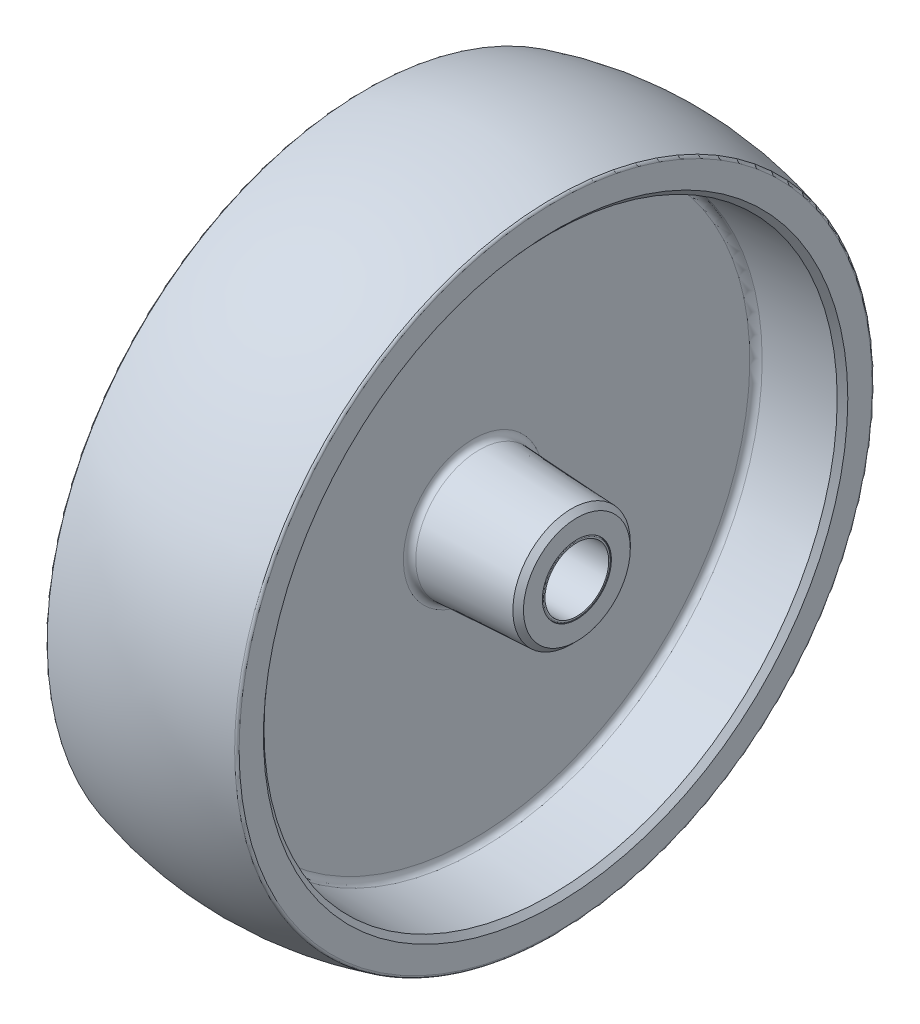
ISO-10303-21;
HEADER;
FILE_DESCRIPTION(('STEP AP214'),'2;1');
FILE_NAME('part.step','',(''),(''),'','','');
FILE_SCHEMA(('AUTOMOTIVE_DESIGN { 1 0 10303 214 1 1 1 1 }'));
ENDSEC;
DATA;
#1=APPLICATION_CONTEXT('core data for automotive mechanical design processes');
#2=APPLICATION_PROTOCOL_DEFINITION('international standard','automotive_design',2000,#1);
#3=PRODUCT_CONTEXT('',#1,'mechanical');
#4=PRODUCT('Part','Part','',(#3));
#5=PRODUCT_RELATED_PRODUCT_CATEGORY('part','',(#4));
#6=PRODUCT_DEFINITION_FORMATION('','',#4);
#7=PRODUCT_DEFINITION_CONTEXT('part definition',#1,'design');
#8=PRODUCT_DEFINITION('design','',#6,#7);
#9=PRODUCT_DEFINITION_SHAPE('','',#8);
#10=(LENGTH_UNIT() NAMED_UNIT(*) SI_UNIT(.MILLI.,.METRE.));
#11=(NAMED_UNIT(*) PLANE_ANGLE_UNIT() SI_UNIT($,.RADIAN.));
#12=(NAMED_UNIT(*) SI_UNIT($,.STERADIAN.) SOLID_ANGLE_UNIT());
#13=UNCERTAINTY_MEASURE_WITH_UNIT(LENGTH_MEASURE(1.E-05),#10,'distance_accuracy_value','');
#14=(GEOMETRIC_REPRESENTATION_CONTEXT(3) GLOBAL_UNCERTAINTY_ASSIGNED_CONTEXT((#13)) GLOBAL_UNIT_ASSIGNED_CONTEXT((#10,
#11,#12)) REPRESENTATION_CONTEXT('',''));
#15=CARTESIAN_POINT('',(0.,0.,0.));
#16=DIRECTION('',(0.,0.,1.));
#17=DIRECTION('',(1.,0.,0.));
#18=AXIS2_PLACEMENT_3D('',#15,#16,#17);
#19=CARTESIAN_POINT('',(2.5,53.1876794211129,0.));
#20=DIRECTION('',(-1.,0.,0.));
#21=DIRECTION('',(0.,0.,1.));
#22=AXIS2_PLACEMENT_3D('',#19,#20,#21);
#23=PLANE('',#22);
#24=CARTESIAN_POINT('',(2.5,0.,0.));
#25=DIRECTION('',(-1.,0.,0.));
#26=DIRECTION('',(0.,1.,0.));
#27=AXIS2_PLACEMENT_3D('',#24,#25,#26);
#28=CIRCLE('',#27,13.1607091760771);
#29=CARTESIAN_POINT('',(2.5,13.1607091760771,0.));
#30=VERTEX_POINT('',#29);
#31=EDGE_CURVE('E143',#30,#30,#28,.T.);
#32=ORIENTED_EDGE('',*,*,#31,.T.);
#33=EDGE_LOOP('',(#32));
#34=FACE_BOUND('',#33,.T.);
#35=CARTESIAN_POINT('',(2.5,0.,0.));
#36=DIRECTION('',(1.,0.,0.));
#37=DIRECTION('',(0.,1.,0.));
#38=AXIS2_PLACEMENT_3D('',#35,#36,#37);
#39=CIRCLE('',#38,52.048921941055);
#40=CARTESIAN_POINT('',(2.5,52.048921941055,0.));
#41=VERTEX_POINT('',#40);
#42=EDGE_CURVE('E127',#41,#41,#39,.T.);
#43=ORIENTED_EDGE('',*,*,#42,.T.);
#44=EDGE_LOOP('',(#43));
#45=FACE_BOUND('',#44,.T.);
#46=ADVANCED_FACE('F16',(#34,#45),#23,.F.);
#47=CARTESIAN_POINT('',(22.,0.,0.));
#48=DIRECTION('',(1.,0.,0.));
#49=DIRECTION('',(0.,-1.,0.));
#50=AXIS2_PLACEMENT_3D('',#47,#48,#49);
#51=PLANE('',#50);
#52=CARTESIAN_POINT('',(22.,0.,0.));
#53=DIRECTION('',(1.,0.,0.));
#54=DIRECTION('',(0.,-1.,0.));
#55=AXIS2_PLACEMENT_3D('',#52,#53,#54);
#56=CIRCLE('',#55,6.5);
#57=CARTESIAN_POINT('',(22.,-6.50000000000003,0.));
#58=VERTEX_POINT('',#57);
#59=EDGE_CURVE('E116',#58,#58,#56,.T.);
#60=ORIENTED_EDGE('',*,*,#59,.F.);
#61=EDGE_LOOP('',(#60));
#62=FACE_BOUND('',#61,.T.);
#63=CARTESIAN_POINT('',(22.,0.,0.));
#64=DIRECTION('',(-1.,0.,0.));
#65=DIRECTION('',(0.,0.,1.));
#66=AXIS2_PLACEMENT_3D('',#63,#64,#65);
#67=CIRCLE('',#66,10.0539529249056);
#68=CARTESIAN_POINT('',(22.,0.,-10.0539529249056));
#69=VERTEX_POINT('',#68);
#70=EDGE_CURVE('E142',#69,#69,#67,.T.);
#71=ORIENTED_EDGE('',*,*,#70,.F.);
#72=EDGE_LOOP('',(#71));
#73=FACE_BOUND('',#72,.T.);
#74=ADVANCED_FACE('F269',(#62,#73),#51,.T.);
#75=CARTESIAN_POINT('',(-2.50000000000001,12.0219516960192,0.));
#76=DIRECTION('',(1.,0.,0.));
#77=DIRECTION('',(0.,-1.,0.));
#78=AXIS2_PLACEMENT_3D('',#75,#76,#77);
#79=PLANE('',#78);
#80=CARTESIAN_POINT('',(-2.50000000000001,0.,0.));
#81=DIRECTION('',(1.,0.,0.));
#82=DIRECTION('',(0.,-1.,0.));
#83=AXIS2_PLACEMENT_3D('',#80,#81,#82);
#84=CIRCLE('',#83,13.1607091760771);
#85=CARTESIAN_POINT('',(-2.50000000000001,-13.1607091760771,0.));
#86=VERTEX_POINT('',#85);
#87=EDGE_CURVE('E152',#86,#86,#84,.T.);
#88=ORIENTED_EDGE('',*,*,#87,.T.);
#89=EDGE_LOOP('',(#88));
#90=FACE_BOUND('',#89,.T.);
#91=CARTESIAN_POINT('',(-2.50000000000001,0.,0.));
#92=DIRECTION('',(-1.,0.,0.));
#93=DIRECTION('',(0.,-1.,0.));
#94=AXIS2_PLACEMENT_3D('',#91,#92,#93);
#95=CIRCLE('',#94,52.048921941055);
#96=CARTESIAN_POINT('',(-2.50000000000001,-52.048921941055,0.));
#97=VERTEX_POINT('',#96);
#98=EDGE_CURVE('E169',#97,#97,#95,.T.);
#99=ORIENTED_EDGE('',*,*,#98,.T.);
#100=EDGE_LOOP('',(#99));
#101=FACE_BOUND('',#100,.T.);
#102=ADVANCED_FACE('F275',(#90,#101),#79,.F.);
#103=CARTESIAN_POINT('',(-22.,62.5,0.));
#104=DIRECTION('',(-1.,0.,0.));
#105=DIRECTION('',(0.,0.,1.));
#106=AXIS2_PLACEMENT_3D('',#103,#104,#105);
#107=PLANE('',#106);
#108=CARTESIAN_POINT('',(-22.,0.,0.));
#109=DIRECTION('',(-1.,0.,0.));
#110=DIRECTION('',(0.,0.,1.));
#111=AXIS2_PLACEMENT_3D('',#108,#109,#110);
#112=CIRCLE('',#111,6.);
#113=CARTESIAN_POINT('',(-22.,0.,6.00000000000006));
#114=VERTEX_POINT('',#113);
#115=EDGE_CURVE('E164',#114,#114,#112,.T.);
#116=ORIENTED_EDGE('',*,*,#115,.F.);
#117=EDGE_LOOP('',(#116));
#118=FACE_BOUND('',#117,.T.);
#119=CARTESIAN_POINT('',(-22.,0.,0.));
#120=DIRECTION('',(-1.,0.,0.));
#121=DIRECTION('',(0.,1.,0.));
#122=AXIS2_PLACEMENT_3D('',#119,#120,#121);
#123=CIRCLE('',#122,6.27301499830369);
#124=CARTESIAN_POINT('',(-22.,6.27301499830366,0.));
#125=VERTEX_POINT('',#124);
#126=EDGE_CURVE('E160',#125,#125,#123,.T.);
#127=ORIENTED_EDGE('',*,*,#126,.T.);
#128=EDGE_LOOP('',(#127));
#129=FACE_BOUND('',#128,.T.);
#130=ADVANCED_FACE('F289',(#118,#129),#107,.T.);
#131=CARTESIAN_POINT('',(18.,62.5,0.));
#132=DIRECTION('',(-1.,0.,0.));
#133=DIRECTION('',(0.,-1.,0.));
#134=AXIS2_PLACEMENT_3D('',#131,#132,#133);
#135=PLANE('',#134);
#136=CARTESIAN_POINT('',(18.,0.,0.));
#137=DIRECTION('',(-1.,0.,0.));
#138=DIRECTION('',(0.,0.,1.));
#139=AXIS2_PLACEMENT_3D('',#136,#137,#138);
#140=CIRCLE('',#139,54.999739506404);
#141=CARTESIAN_POINT('',(17.9999999999998,0.,-54.9997395064041));
#142=VERTEX_POINT('',#141);
#143=EDGE_CURVE('E139',#142,#142,#140,.T.);
#144=ORIENTED_EDGE('',*,*,#143,.T.);
#145=EDGE_LOOP('',(#144));
#146=FACE_BOUND('',#145,.T.);
#147=CARTESIAN_POINT('',(18.,0.,0.));
#148=DIRECTION('',(1.,0.,0.));
#149=DIRECTION('',(0.,0.,1.));
#150=AXIS2_PLACEMENT_3D('',#147,#148,#149);
#151=CIRCLE('',#150,59.580592780675);
#152=CARTESIAN_POINT('',(18.0000000000002,0.,59.5805927806749));
#153=VERTEX_POINT('',#152);
#154=EDGE_CURVE('E173',#153,#153,#151,.T.);
#155=ORIENTED_EDGE('',*,*,#154,.T.);
#156=EDGE_LOOP('',(#155));
#157=FACE_BOUND('',#156,.T.);
#158=ADVANCED_FACE('F307',(#146,#157),#135,.F.);
#159=CARTESIAN_POINT('',(-18.,62.5,0.));
#160=DIRECTION('',(1.,0.,0.));
#161=DIRECTION('',(0.,0.,-1.));
#162=AXIS2_PLACEMENT_3D('',#159,#160,#161);
#163=PLANE('',#162);
#164=CARTESIAN_POINT('',(-18.,0.,0.));
#165=DIRECTION('',(-1.,0.,0.));
#166=DIRECTION('',(0.,0.,1.));
#167=AXIS2_PLACEMENT_3D('',#164,#165,#166);
#168=CIRCLE('',#167,54.999739506404);
#169=CARTESIAN_POINT('',(-17.9999999999998,0.,54.999739506404));
#170=VERTEX_POINT('',#169);
#171=EDGE_CURVE('E10',#170,#170,#168,.T.);
#172=ORIENTED_EDGE('',*,*,#171,.F.);
#173=EDGE_LOOP('',(#172));
#174=FACE_BOUND('',#173,.T.);
#175=CARTESIAN_POINT('',(-18.,0.,0.));
#176=DIRECTION('',(-1.,0.,0.));
#177=DIRECTION('',(0.,0.,-1.));
#178=AXIS2_PLACEMENT_3D('',#175,#176,#177);
#179=CIRCLE('',#178,59.580592780675);
#180=CARTESIAN_POINT('',(-18.0000000000002,0.,-59.5805927806749));
#181=VERTEX_POINT('',#180);
#182=EDGE_CURVE('E156',#181,#181,#179,.T.);
#183=ORIENTED_EDGE('',*,*,#182,.T.);
#184=EDGE_LOOP('',(#183));
#185=FACE_BOUND('',#184,.T.);
#186=ADVANCED_FACE('F18',(#174,#185),#163,.F.);
#187=CARTESIAN_POINT('',(22.,0.,0.));
#188=DIRECTION('',(1.,0.,0.));
#189=DIRECTION('',(0.,-1.,0.));
#190=AXIS2_PLACEMENT_3D('',#187,#188,#189);
#191=PLANE('',#190);
#192=CARTESIAN_POINT('',(22.,0.,0.));
#193=DIRECTION('',(-1.,0.,0.));
#194=DIRECTION('',(0.,0.,1.));
#195=AXIS2_PLACEMENT_3D('',#192,#193,#194);
#196=CIRCLE('',#195,6.);
#197=CARTESIAN_POINT('',(22.,0.,5.99999999999992));
#198=VERTEX_POINT('',#197);
#199=EDGE_CURVE('E151',#198,#198,#196,.T.);
#200=ORIENTED_EDGE('',*,*,#199,.T.);
#201=EDGE_LOOP('',(#200));
#202=FACE_BOUND('',#201,.T.);
#203=CARTESIAN_POINT('',(22.,0.,0.));
#204=DIRECTION('',(-1.,0.,0.));
#205=DIRECTION('',(0.,1.,0.));
#206=AXIS2_PLACEMENT_3D('',#203,#204,#205);
#207=CIRCLE('',#206,6.2730149983037);
#208=CARTESIAN_POINT('',(22.,-6.27301499830374,0.));
#209=VERTEX_POINT('',#208);
#210=EDGE_CURVE('E130',#209,#209,#207,.T.);
#211=ORIENTED_EDGE('',*,*,#210,.F.);
#212=EDGE_LOOP('',(#211));
#213=FACE_BOUND('',#212,.T.);
#214=ADVANCED_FACE('F298',(#202,#213),#191,.T.);
#215=CARTESIAN_POINT('',(-22.,62.5,0.));
#216=DIRECTION('',(-1.,0.,0.));
#217=DIRECTION('',(0.,0.,1.));
#218=AXIS2_PLACEMENT_3D('',#215,#216,#217);
#219=PLANE('',#218);
#220=CARTESIAN_POINT('',(-22.,0.,0.));
#221=DIRECTION('',(-1.,0.,0.));
#222=DIRECTION('',(0.,1.,0.));
#223=AXIS2_PLACEMENT_3D('',#220,#221,#222);
#224=CIRCLE('',#223,6.5);
#225=CARTESIAN_POINT('',(-22.,6.49999999999998,0.));
#226=VERTEX_POINT('',#225);
#227=EDGE_CURVE('E155',#226,#226,#224,.T.);
#228=ORIENTED_EDGE('',*,*,#227,.F.);
#229=EDGE_LOOP('',(#228));
#230=FACE_BOUND('',#229,.T.);
#231=CARTESIAN_POINT('',(-22.,0.,0.));
#232=DIRECTION('',(-1.,0.,0.));
#233=DIRECTION('',(0.,0.,1.));
#234=AXIS2_PLACEMENT_3D('',#231,#232,#233);
#235=CIRCLE('',#234,10.0539529249056);
#236=CARTESIAN_POINT('',(-22.,0.,-10.0539529249055));
#237=VERTEX_POINT('',#236);
#238=EDGE_CURVE('E27',#237,#237,#235,.T.);
#239=ORIENTED_EDGE('',*,*,#238,.T.);
#240=EDGE_LOOP('',(#239));
#241=FACE_BOUND('',#240,.T.);
#242=ADVANCED_FACE('F300',(#230,#241),#219,.T.);
#243=CARTESIAN_POINT('',(0.,0.,0.));
#244=DIRECTION('',(1.,0.,0.));
#245=DIRECTION('',(0.,1.,0.));
#246=AXIS2_PLACEMENT_3D('',#243,#244,#245);
#247=DEGENERATE_TOROIDAL_SURFACE('',#246,2.5,65.,.F.);
#248=CARTESIAN_POINT('',(17.6356589147287,0.,0.));
#249=DIRECTION('',(-1.,0.,0.));
#250=DIRECTION('',(0.,0.,1.));
#251=AXIS2_PLACEMENT_3D('',#248,#249,#250);
#252=CIRCLE('',#251,60.0618376859516);
#253=CARTESIAN_POINT('',(17.6356589147287,-60.0618376859516,0.));
#254=VERTEX_POINT('',#253);
#255=EDGE_CURVE('E20',#254,#254,#252,.T.);
#256=ORIENTED_EDGE('',*,*,#255,.T.);
#257=EDGE_LOOP('',(#256));
#258=FACE_BOUND('',#257,.T.);
#259=CARTESIAN_POINT('',(-17.6356589147287,0.,0.));
#260=DIRECTION('',(1.,0.,0.));
#261=DIRECTION('',(0.,0.,-1.));
#262=AXIS2_PLACEMENT_3D('',#259,#260,#261);
#263=CIRCLE('',#262,60.0618376859516);
#264=CARTESIAN_POINT('',(-17.6356589147287,-60.0618376859516,0.));
#265=VERTEX_POINT('',#264);
#266=EDGE_CURVE('E159',#265,#265,#263,.T.);
#267=ORIENTED_EDGE('',*,*,#266,.T.);
#268=EDGE_LOOP('',(#267));
#269=FACE_BOUND('',#268,.T.);
#270=ADVANCED_FACE('F186',(#258,#269),#247,.F.);
#271=CARTESIAN_POINT('',(-18.,0.,0.));
#272=DIRECTION('',(-1.,0.,0.));
#273=DIRECTION('',(0.,0.,1.));
#274=AXIS2_PLACEMENT_3D('',#271,#272,#273);
#275=CONICAL_SURFACE('',#274,54.999739506404,0.83775804095728);
#276=ORIENTED_EDGE('',*,*,#171,.T.);
#277=EDGE_LOOP('',(#276));
#278=FACE_BOUND('',#277,.T.);
#279=CARTESIAN_POINT('',(-17.0552494495425,0.,0.));
#280=DIRECTION('',(-1.,0.,0.));
#281=DIRECTION('',(0.,0.,1.));
#282=AXIS2_PLACEMENT_3D('',#279,#280,#281);
#283=CIRCLE('',#282,53.9504877216741);
#284=CARTESIAN_POINT('',(-17.0552494495427,0.,-53.9504877216741));
#285=VERTEX_POINT('',#284);
#286=EDGE_CURVE('E136',#285,#285,#283,.T.);
#287=ORIENTED_EDGE('',*,*,#286,.F.);
#288=EDGE_LOOP('',(#287));
#289=FACE_BOUND('',#288,.T.);
#290=ADVANCED_FACE('F354',(#278,#289),#275,.F.);
#291=CARTESIAN_POINT('',(-21.0016306018441,0.,0.));
#292=DIRECTION('',(1.,0.,0.));
#293=DIRECTION('',(0.,0.,-1.));
#294=AXIS2_PLACEMENT_3D('',#291,#292,#293);
#295=CONICAL_SURFACE('',#294,11.0523223230615,0.785398163397446);
#296=CARTESIAN_POINT('',(-21.0016306018441,0.,0.));
#297=DIRECTION('',(-1.,0.,0.));
#298=DIRECTION('',(0.,0.,1.));
#299=AXIS2_PLACEMENT_3D('',#296,#297,#298);
#300=CIRCLE('',#299,11.0523223230615);
#301=CARTESIAN_POINT('',(-21.0016306018441,0.,-11.0523223230615));
#302=VERTEX_POINT('',#301);
#303=EDGE_CURVE('E138',#302,#302,#300,.T.);
#304=ORIENTED_EDGE('',*,*,#303,.T.);
#305=EDGE_LOOP('',(#304));
#306=FACE_BOUND('',#305,.T.);
#307=ORIENTED_EDGE('',*,*,#238,.F.);
#308=EDGE_LOOP('',(#307));
#309=FACE_BOUND('',#308,.T.);
#310=ADVANCED_FACE('F285',(#306,#309),#295,.T.);
#311=CARTESIAN_POINT('',(-18.,0.,0.));
#312=DIRECTION('',(1.,0.,0.));
#313=DIRECTION('',(0.,0.,-1.));
#314=AXIS2_PLACEMENT_3D('',#311,#312,#313);
#315=CONICAL_SURFACE('',#314,11.2096311171322,0.0523598775598265);
#316=CARTESIAN_POINT('',(-3.63719685250848,0.,0.));
#317=DIRECTION('',(-1.,0.,0.));
#318=DIRECTION('',(0.,0.,-1.));
#319=AXIS2_PLACEMENT_3D('',#316,#317,#318);
#320=CIRCLE('',#319,11.9623537343716);
#321=CARTESIAN_POINT('',(-3.63719685250852,0.,-11.9623537343716));
#322=VERTEX_POINT('',#321);
#323=EDGE_CURVE('E147',#322,#322,#320,.T.);
#324=ORIENTED_EDGE('',*,*,#323,.T.);
#325=EDGE_LOOP('',(#324));
#326=FACE_BOUND('',#325,.T.);
#327=ORIENTED_EDGE('',*,*,#303,.F.);
#328=EDGE_LOOP('',(#327));
#329=FACE_BOUND('',#328,.T.);
#330=ADVANCED_FACE('F281',(#326,#329),#315,.T.);
#331=CARTESIAN_POINT('',(-18.,0.,0.));
#332=DIRECTION('',(-1.,0.,0.));
#333=DIRECTION('',(0.,1.,0.));
#334=AXIS2_PLACEMENT_3D('',#331,#332,#333);
#335=CONICAL_SURFACE('',#334,54.,0.0523598775598306);
#336=ORIENTED_EDGE('',*,*,#286,.T.);
#337=EDGE_LOOP('',(#336));
#338=FACE_BOUND('',#337,.T.);
#339=CARTESIAN_POINT('',(-3.63719685250848,0.,0.));
#340=DIRECTION('',(1.,0.,0.));
#341=DIRECTION('',(0.,1.,0.));
#342=AXIS2_PLACEMENT_3D('',#339,#340,#341);
#343=CIRCLE('',#342,53.2472773827605);
#344=CARTESIAN_POINT('',(-3.6371968525085,-53.2472773827605,0.));
#345=VERTEX_POINT('',#344);
#346=EDGE_CURVE('E233',#345,#345,#343,.T.);
#347=ORIENTED_EDGE('',*,*,#346,.T.);
#348=EDGE_LOOP('',(#347));
#349=FACE_BOUND('',#348,.T.);
#350=ADVANCED_FACE('F284',(#338,#349),#335,.F.);
#351=CARTESIAN_POINT('',(17.0552494495425,0.,0.));
#352=DIRECTION('',(1.,0.,0.));
#353=DIRECTION('',(0.,0.,-1.));
#354=AXIS2_PLACEMENT_3D('',#351,#352,#353);
#355=CONICAL_SURFACE('',#354,53.9504877216741,0.83775804095728);
#356=ORIENTED_EDGE('',*,*,#143,.F.);
#357=EDGE_LOOP('',(#356));
#358=FACE_BOUND('',#357,.T.);
#359=CARTESIAN_POINT('',(17.0552494495425,0.,0.));
#360=DIRECTION('',(-1.,0.,0.));
#361=DIRECTION('',(0.,0.,1.));
#362=AXIS2_PLACEMENT_3D('',#359,#360,#361);
#363=CIRCLE('',#362,53.9504877216741);
#364=CARTESIAN_POINT('',(17.0552494495423,0.,-53.9504877216742));
#365=VERTEX_POINT('',#364);
#366=EDGE_CURVE('E167',#365,#365,#363,.T.);
#367=ORIENTED_EDGE('',*,*,#366,.T.);
#368=EDGE_LOOP('',(#367));
#369=FACE_BOUND('',#368,.T.);
#370=ADVANCED_FACE('F329',(#358,#369),#355,.F.);
#371=CARTESIAN_POINT('',(22.,0.,0.));
#372=DIRECTION('',(-1.,0.,0.));
#373=DIRECTION('',(0.,0.,1.));
#374=AXIS2_PLACEMENT_3D('',#371,#372,#373);
#375=CONICAL_SURFACE('',#374,10.0539529249056,0.785398163397446);
#376=CARTESIAN_POINT('',(21.001630601844,0.,0.));
#377=DIRECTION('',(-1.,0.,0.));
#378=DIRECTION('',(0.,0.,1.));
#379=AXIS2_PLACEMENT_3D('',#376,#377,#378);
#380=CIRCLE('',#379,11.0523223230615);
#381=CARTESIAN_POINT('',(21.0016306018439,0.,-11.0523223230616));
#382=VERTEX_POINT('',#381);
#383=EDGE_CURVE('E225',#382,#382,#380,.T.);
#384=ORIENTED_EDGE('',*,*,#383,.F.);
#385=EDGE_LOOP('',(#384));
#386=FACE_BOUND('',#385,.T.);
#387=ORIENTED_EDGE('',*,*,#70,.T.);
#388=EDGE_LOOP('',(#387));
#389=FACE_BOUND('',#388,.T.);
#390=ADVANCED_FACE('F332',(#386,#389),#375,.T.);
#391=CARTESIAN_POINT('',(22.8989358438028,0.,0.));
#392=DIRECTION('',(-1.,0.,0.));
#393=DIRECTION('',(0.,0.,1.));
#394=AXIS2_PLACEMENT_3D('',#391,#392,#393);
#395=CONICAL_SURFACE('',#394,10.9528887687084,0.0523598775598265);
#396=CARTESIAN_POINT('',(3.63719685250845,0.,0.));
#397=DIRECTION('',(1.,0.,0.));
#398=DIRECTION('',(0.,0.,1.));
#399=AXIS2_PLACEMENT_3D('',#396,#397,#398);
#400=CIRCLE('',#399,11.9623537343716);
#401=CARTESIAN_POINT('',(3.63719685250841,0.,-11.9623537343716));
#402=VERTEX_POINT('',#401);
#403=EDGE_CURVE('E146',#402,#402,#400,.T.);
#404=ORIENTED_EDGE('',*,*,#403,.T.);
#405=EDGE_LOOP('',(#404));
#406=FACE_BOUND('',#405,.T.);
#407=ORIENTED_EDGE('',*,*,#383,.T.);
#408=EDGE_LOOP('',(#407));
#409=FACE_BOUND('',#408,.T.);
#410=ADVANCED_FACE('F337',(#406,#409),#395,.T.);
#411=CARTESIAN_POINT('',(2.5,0.,0.));
#412=DIRECTION('',(1.,0.,0.));
#413=DIRECTION('',(0.,-1.,0.));
#414=AXIS2_PLACEMENT_3D('',#411,#412,#413);
#415=CONICAL_SURFACE('',#414,53.1876794211129,0.0523598775598306);
#416=ORIENTED_EDGE('',*,*,#366,.F.);
#417=EDGE_LOOP('',(#416));
#418=FACE_BOUND('',#417,.T.);
#419=CARTESIAN_POINT('',(3.63719685250844,0.,0.));
#420=DIRECTION('',(-1.,0.,0.));
#421=DIRECTION('',(0.,-1.,0.));
#422=AXIS2_PLACEMENT_3D('',#419,#420,#421);
#423=CIRCLE('',#422,53.2472773827605);
#424=CARTESIAN_POINT('',(3.63719685250845,53.2472773827605,0.));
#425=VERTEX_POINT('',#424);
#426=EDGE_CURVE('E120',#425,#425,#423,.T.);
#427=ORIENTED_EDGE('',*,*,#426,.T.);
#428=EDGE_LOOP('',(#427));
#429=FACE_BOUND('',#428,.T.);
#430=ADVANCED_FACE('F294',(#418,#429),#415,.F.);
#431=CARTESIAN_POINT('',(-22.,0.,0.));
#432=DIRECTION('',(-1.,0.,0.));
#433=DIRECTION('',(0.,0.,1.));
#434=AXIS2_PLACEMENT_3D('',#431,#432,#433);
#435=CYLINDRICAL_SURFACE('',#434,6.);
#436=ORIENTED_EDGE('',*,*,#115,.T.);
#437=EDGE_LOOP('',(#436));
#438=FACE_BOUND('',#437,.T.);
#439=ORIENTED_EDGE('',*,*,#199,.F.);
#440=EDGE_LOOP('',(#439));
#441=FACE_BOUND('',#440,.T.);
#442=ADVANCED_FACE('F291',(#438,#441),#435,.F.);
#443=CARTESIAN_POINT('',(-3.7,0.,0.));
#444=DIRECTION('',(1.,0.,0.));
#445=DIRECTION('',(0.,-1.,0.));
#446=AXIS2_PLACEMENT_3D('',#443,#444,#445);
#447=TOROIDAL_SURFACE('',#446,13.1607091760771,1.2);
#448=ORIENTED_EDGE('',*,*,#323,.F.);
#449=EDGE_LOOP('',(#448));
#450=FACE_BOUND('',#449,.T.);
#451=ORIENTED_EDGE('',*,*,#87,.F.);
#452=EDGE_LOOP('',(#451));
#453=FACE_BOUND('',#452,.T.);
#454=ADVANCED_FACE('F279',(#450,#453),#447,.F.);
#455=CARTESIAN_POINT('',(-3.7,0.,0.));
#456=DIRECTION('',(1.,0.,0.));
#457=DIRECTION('',(0.,-1.,0.));
#458=AXIS2_PLACEMENT_3D('',#455,#456,#457);
#459=TOROIDAL_SURFACE('',#458,52.048921941055,1.2);
#460=ORIENTED_EDGE('',*,*,#98,.F.);
#461=EDGE_LOOP('',(#460));
#462=FACE_BOUND('',#461,.T.);
#463=ORIENTED_EDGE('',*,*,#346,.F.);
#464=EDGE_LOOP('',(#463));
#465=FACE_BOUND('',#464,.T.);
#466=ADVANCED_FACE('F350',(#462,#465),#459,.F.);
#467=CARTESIAN_POINT('',(3.69999999999999,0.,0.));
#468=DIRECTION('',(-1.,0.,0.));
#469=DIRECTION('',(0.,1.,0.));
#470=AXIS2_PLACEMENT_3D('',#467,#468,#469);
#471=TOROIDAL_SURFACE('',#470,13.1607091760771,1.2);
#472=ORIENTED_EDGE('',*,*,#403,.F.);
#473=EDGE_LOOP('',(#472));
#474=FACE_BOUND('',#473,.T.);
#475=ORIENTED_EDGE('',*,*,#31,.F.);
#476=EDGE_LOOP('',(#475));
#477=FACE_BOUND('',#476,.T.);
#478=ADVANCED_FACE('F342',(#474,#477),#471,.F.);
#479=CARTESIAN_POINT('',(3.69999999999999,0.,0.));
#480=DIRECTION('',(-1.,0.,0.));
#481=DIRECTION('',(0.,1.,0.));
#482=AXIS2_PLACEMENT_3D('',#479,#480,#481);
#483=TOROIDAL_SURFACE('',#482,52.048921941055,1.2);
#484=ORIENTED_EDGE('',*,*,#42,.F.);
#485=EDGE_LOOP('',(#484));
#486=FACE_BOUND('',#485,.T.);
#487=ORIENTED_EDGE('',*,*,#426,.F.);
#488=EDGE_LOOP('',(#487));
#489=FACE_BOUND('',#488,.T.);
#490=ADVANCED_FACE('F340',(#486,#489),#483,.F.);
#491=CARTESIAN_POINT('',(-22.8989358438029,0.,0.));
#492=DIRECTION('',(-1.,0.,0.));
#493=DIRECTION('',(0.,1.,0.));
#494=AXIS2_PLACEMENT_3D('',#491,#492,#493);
#495=CYLINDRICAL_SURFACE('',#494,6.5);
#496=CARTESIAN_POINT('',(21.7730149983037,0.,0.));
#497=DIRECTION('',(-1.,0.,0.));
#498=DIRECTION('',(0.,1.,0.));
#499=AXIS2_PLACEMENT_3D('',#496,#497,#498);
#500=CIRCLE('',#499,6.5);
#501=CARTESIAN_POINT('',(21.7730149983037,6.49999999999998,0.));
#502=VERTEX_POINT('',#501);
#503=EDGE_CURVE('E121',#502,#502,#500,.T.);
#504=ORIENTED_EDGE('',*,*,#503,.T.);
#505=EDGE_LOOP('',(#504));
#506=FACE_BOUND('',#505,.T.);
#507=ORIENTED_EDGE('',*,*,#59,.T.);
#508=EDGE_LOOP('',(#507));
#509=FACE_BOUND('',#508,.T.);
#510=ADVANCED_FACE('F117',(#506,#509),#495,.F.);
#511=CARTESIAN_POINT('',(21.7730149983037,0.,0.));
#512=DIRECTION('',(-1.,0.,0.));
#513=DIRECTION('',(0.,1.,0.));
#514=AXIS2_PLACEMENT_3D('',#511,#512,#513);
#515=TOROIDAL_SURFACE('',#514,6.2730149983037,0.226985001696315);
#516=ORIENTED_EDGE('',*,*,#503,.F.);
#517=EDGE_LOOP('',(#516));
#518=FACE_BOUND('',#517,.T.);
#519=ORIENTED_EDGE('',*,*,#210,.T.);
#520=EDGE_LOOP('',(#519));
#521=FACE_BOUND('',#520,.T.);
#522=ADVANCED_FACE('F254',(#518,#521),#515,.T.);
#523=CARTESIAN_POINT('',(-22.8989358438029,0.,0.));
#524=DIRECTION('',(-1.,0.,0.));
#525=DIRECTION('',(0.,1.,0.));
#526=AXIS2_PLACEMENT_3D('',#523,#524,#525);
#527=CYLINDRICAL_SURFACE('',#526,6.5);
#528=ORIENTED_EDGE('',*,*,#227,.T.);
#529=EDGE_LOOP('',(#528));
#530=FACE_BOUND('',#529,.T.);
#531=CARTESIAN_POINT('',(-21.7730149983037,0.,0.));
#532=DIRECTION('',(-1.,0.,0.));
#533=DIRECTION('',(0.,1.,0.));
#534=AXIS2_PLACEMENT_3D('',#531,#532,#533);
#535=CIRCLE('',#534,6.5);
#536=CARTESIAN_POINT('',(-21.7730149983037,-6.50000000000003,0.));
#537=VERTEX_POINT('',#536);
#538=EDGE_CURVE('E134',#537,#537,#535,.T.);
#539=ORIENTED_EDGE('',*,*,#538,.F.);
#540=EDGE_LOOP('',(#539));
#541=FACE_BOUND('',#540,.T.);
#542=ADVANCED_FACE('F252',(#530,#541),#527,.F.);
#543=CARTESIAN_POINT('',(-21.7730149983037,0.,0.));
#544=DIRECTION('',(-1.,0.,0.));
#545=DIRECTION('',(0.,1.,0.));
#546=AXIS2_PLACEMENT_3D('',#543,#544,#545);
#547=TOROIDAL_SURFACE('',#546,6.27301499830369,0.226985001696318);
#548=ORIENTED_EDGE('',*,*,#126,.F.);
#549=EDGE_LOOP('',(#548));
#550=FACE_BOUND('',#549,.T.);
#551=ORIENTED_EDGE('',*,*,#538,.T.);
#552=EDGE_LOOP('',(#551));
#553=FACE_BOUND('',#552,.T.);
#554=ADVANCED_FACE('F250',(#550,#553),#547,.T.);
#555=CARTESIAN_POINT('',(-17.5,0.,0.));
#556=DIRECTION('',(1.,0.,0.));
#557=DIRECTION('',(0.,0.,-1.));
#558=AXIS2_PLACEMENT_3D('',#555,#556,#557);
#559=TOROIDAL_SURFACE('',#558,59.580592780675,0.5);
#560=ORIENTED_EDGE('',*,*,#266,.F.);
#561=EDGE_LOOP('',(#560));
#562=FACE_BOUND('',#561,.T.);
#563=ORIENTED_EDGE('',*,*,#182,.F.);
#564=EDGE_LOOP('',(#563));
#565=FACE_BOUND('',#564,.T.);
#566=ADVANCED_FACE('F194',(#562,#565),#559,.T.);
#567=CARTESIAN_POINT('',(17.5,0.,0.));
#568=DIRECTION('',(-1.,0.,0.));
#569=DIRECTION('',(0.,0.,1.));
#570=AXIS2_PLACEMENT_3D('',#567,#568,#569);
#571=TOROIDAL_SURFACE('',#570,59.580592780675,0.5);
#572=ORIENTED_EDGE('',*,*,#255,.F.);
#573=EDGE_LOOP('',(#572));
#574=FACE_BOUND('',#573,.T.);
#575=ORIENTED_EDGE('',*,*,#154,.F.);
#576=EDGE_LOOP('',(#575));
#577=FACE_BOUND('',#576,.T.);
#578=ADVANCED_FACE('F191',(#574,#577),#571,.T.);
#579=CLOSED_SHELL('',(#46,#74,#102,#130,#158,#186,#214,#242,#270,#290,#310,#330,#350,#370,#390,
#410,#430,#442,#454,#466,#478,#490,#510,#522,#542,#554,#566,#578));
#580=MANIFOLD_SOLID_BREP('B1',#579);
#581=ADVANCED_BREP_SHAPE_REPRESENTATION('',(#18,#580),#14);
#582=SHAPE_DEFINITION_REPRESENTATION(#9,#581);
ENDSEC;
END-ISO-10303-21;
